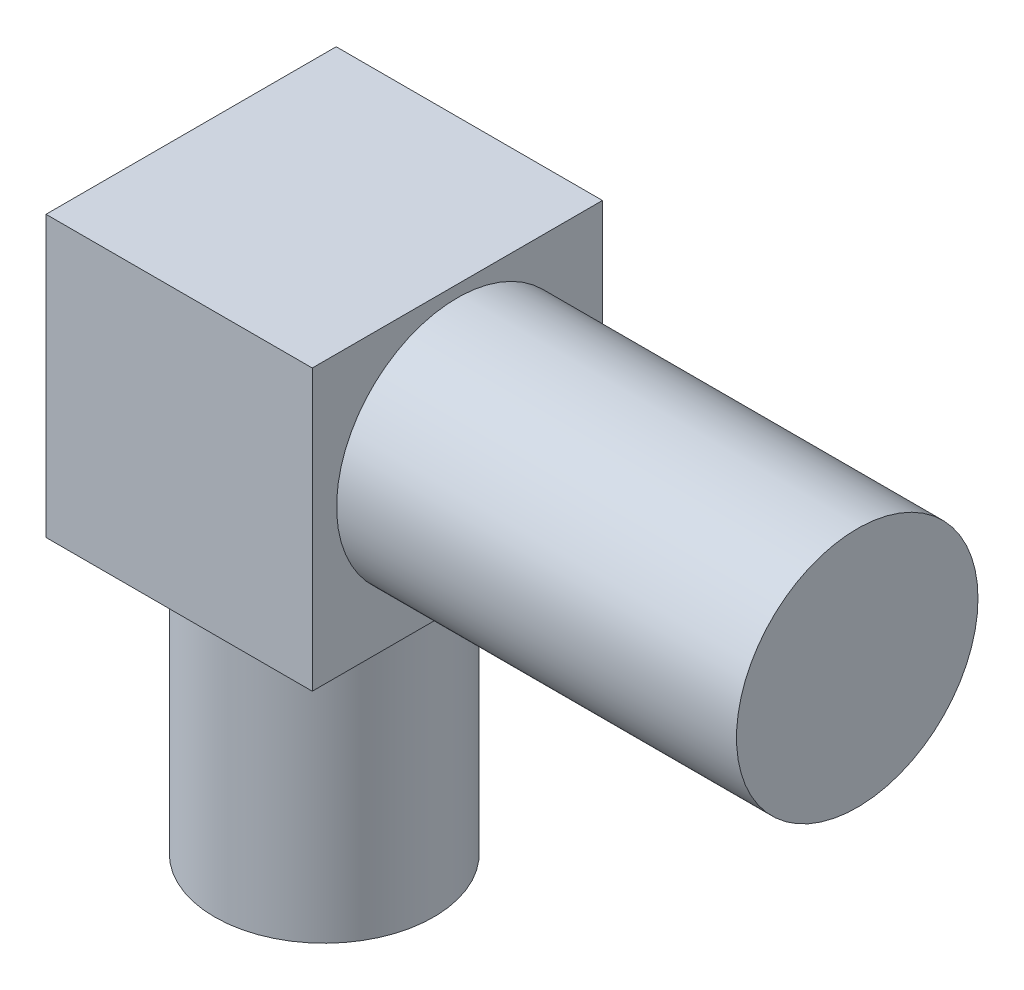
ISO-10303-21;
HEADER;
FILE_DESCRIPTION(('STEP AP214'),'2;1');
FILE_NAME('part.step','',(''),(''),'','','');
FILE_SCHEMA(('AUTOMOTIVE_DESIGN { 1 0 10303 214 1 1 1 1 }'));
ENDSEC;
DATA;
#1=APPLICATION_CONTEXT('core data for automotive mechanical design processes');
#2=APPLICATION_PROTOCOL_DEFINITION('international standard','automotive_design',2000,#1);
#3=PRODUCT_CONTEXT('',#1,'mechanical');
#4=PRODUCT('Part','Part','',(#3));
#5=PRODUCT_RELATED_PRODUCT_CATEGORY('part','',(#4));
#6=PRODUCT_DEFINITION_FORMATION('','',#4);
#7=PRODUCT_DEFINITION_CONTEXT('part definition',#1,'design');
#8=PRODUCT_DEFINITION('design','',#6,#7);
#9=PRODUCT_DEFINITION_SHAPE('','',#8);
#10=(LENGTH_UNIT() NAMED_UNIT(*) SI_UNIT(.MILLI.,.METRE.));
#11=(NAMED_UNIT(*) PLANE_ANGLE_UNIT() SI_UNIT($,.RADIAN.));
#12=(NAMED_UNIT(*) SI_UNIT($,.STERADIAN.) SOLID_ANGLE_UNIT());
#13=UNCERTAINTY_MEASURE_WITH_UNIT(LENGTH_MEASURE(1.E-05),#10,'distance_accuracy_value','');
#14=(GEOMETRIC_REPRESENTATION_CONTEXT(3) GLOBAL_UNCERTAINTY_ASSIGNED_CONTEXT((#13)) GLOBAL_UNIT_ASSIGNED_CONTEXT((#10,
#11,#12)) REPRESENTATION_CONTEXT('',''));
#15=CARTESIAN_POINT('',(0.,0.,0.));
#16=DIRECTION('',(0.,0.,1.));
#17=DIRECTION('',(1.,0.,0.));
#18=AXIS2_PLACEMENT_3D('',#15,#16,#17);
#19=CARTESIAN_POINT('',(0.,56.,0.));
#20=DIRECTION('',(0.,-1.,0.));
#21=DIRECTION('',(0.,0.,-1.));
#22=AXIS2_PLACEMENT_3D('',#19,#20,#21);
#23=CYLINDRICAL_SURFACE('',#22,21.9211314648751);
#24=CARTESIAN_POINT('',(0.,56.,0.));
#25=DIRECTION('',(0.,1.,0.));
#26=DIRECTION('',(0.,0.,1.));
#27=AXIS2_PLACEMENT_3D('',#24,#25,#26);
#28=CIRCLE('',#27,21.9211314648751);
#29=CARTESIAN_POINT('',(0.,56.,21.9211314648751));
#30=VERTEX_POINT('',#29);
#31=EDGE_CURVE('E49',#30,#30,#28,.T.);
#32=ORIENTED_EDGE('',*,*,#31,.F.);
#33=EDGE_LOOP('',(#32));
#34=FACE_BOUND('',#33,.T.);
#35=CARTESIAN_POINT('',(0.,0.,0.));
#36=DIRECTION('',(0.,1.,0.));
#37=DIRECTION('',(0.,0.,1.));
#38=AXIS2_PLACEMENT_3D('',#35,#36,#37);
#39=CIRCLE('',#38,21.9211314648751);
#40=CARTESIAN_POINT('',(0.,0.,21.9211314648751));
#41=VERTEX_POINT('',#40);
#42=EDGE_CURVE('E42',#41,#41,#39,.T.);
#43=ORIENTED_EDGE('',*,*,#42,.T.);
#44=EDGE_LOOP('',(#43));
#45=FACE_BOUND('',#44,.T.);
#46=ADVANCED_FACE('F39',(#34,#45),#23,.T.);
#47=CARTESIAN_POINT('',(0.,0.,0.));
#48=DIRECTION('',(0.,1.,0.));
#49=DIRECTION('',(0.,0.,1.));
#50=AXIS2_PLACEMENT_3D('',#47,#48,#49);
#51=PLANE('',#50);
#52=ORIENTED_EDGE('',*,*,#42,.F.);
#53=EDGE_LOOP('',(#52));
#54=FACE_BOUND('',#53,.T.);
#55=ADVANCED_FACE('F138',(#54),#51,.F.);
#56=CARTESIAN_POINT('',(26.6334731459423,112.,29.026841058146));
#57=DIRECTION('',(-1.,0.,0.));
#58=DIRECTION('',(0.,0.,1.));
#59=AXIS2_PLACEMENT_3D('',#56,#57,#58);
#60=PLANE('',#59);
#61=CARTESIAN_POINT('',(26.6334731459423,85.4953466597728,0.));
#62=DIRECTION('',(1.,0.,0.));
#63=DIRECTION('',(0.,0.,-1.));
#64=AXIS2_PLACEMENT_3D('',#61,#62,#63);
#65=CIRCLE('',#64,24.1568462081051);
#66=CARTESIAN_POINT('',(26.6334731459423,85.4953466597728,-24.1568462081051));
#67=VERTEX_POINT('',#66);
#68=EDGE_CURVE('E11',#67,#67,#65,.T.);
#69=ORIENTED_EDGE('',*,*,#68,.F.);
#70=EDGE_LOOP('',(#69));
#71=FACE_BOUND('',#70,.T.);
#72=DIRECTION('',(0.,0.,-1.));
#73=VECTOR('',#72,1.);
#74=CARTESIAN_POINT('',(26.6334731459423,56.,29.026841058146));
#75=LINE('',#74,#73);
#76=CARTESIAN_POINT('',(26.6334731459423,56.,29.026841058146));
#77=VERTEX_POINT('',#76);
#78=CARTESIAN_POINT('',(26.6334731459423,56.,-29.026841058146));
#79=VERTEX_POINT('',#78);
#80=EDGE_CURVE('E113',#77,#79,#75,.T.);
#81=ORIENTED_EDGE('',*,*,#80,.T.);
#82=DIRECTION('',(0.,-1.,0.));
#83=VECTOR('',#82,1.);
#84=CARTESIAN_POINT('',(26.6334731459423,112.,-29.026841058146));
#85=LINE('',#84,#83);
#86=CARTESIAN_POINT('',(26.6334731459423,112.,-29.026841058146));
#87=VERTEX_POINT('',#86);
#88=EDGE_CURVE('E102',#87,#79,#85,.T.);
#89=ORIENTED_EDGE('',*,*,#88,.F.);
#90=DIRECTION('',(0.,0.,-1.));
#91=VECTOR('',#90,1.);
#92=CARTESIAN_POINT('',(26.6334731459423,112.,29.026841058146));
#93=LINE('',#92,#91);
#94=CARTESIAN_POINT('',(26.6334731459423,112.,29.026841058146));
#95=VERTEX_POINT('',#94);
#96=EDGE_CURVE('E94',#95,#87,#93,.T.);
#97=ORIENTED_EDGE('',*,*,#96,.F.);
#98=DIRECTION('',(0.,-1.,0.));
#99=VECTOR('',#98,1.);
#100=CARTESIAN_POINT('',(26.6334731459423,112.,29.026841058146));
#101=LINE('',#100,#99);
#102=EDGE_CURVE('E109',#95,#77,#101,.T.);
#103=ORIENTED_EDGE('',*,*,#102,.T.);
#104=EDGE_LOOP('',(#81,#89,#97,#103));
#105=FACE_BOUND('',#104,.T.);
#106=ADVANCED_FACE('F140',(#71,#105),#60,.F.);
#107=CARTESIAN_POINT('',(-26.6334731459423,112.,-29.026841058146));
#108=DIRECTION('',(0.,0.,1.));
#109=DIRECTION('',(1.,0.,0.));
#110=AXIS2_PLACEMENT_3D('',#107,#108,#109);
#111=PLANE('',#110);
#112=DIRECTION('',(-1.,0.,0.));
#113=VECTOR('',#112,1.);
#114=CARTESIAN_POINT('',(-26.6334731459423,56.,-29.026841058146));
#115=LINE('',#114,#113);
#116=CARTESIAN_POINT('',(-26.6334731459423,56.,-29.026841058146));
#117=VERTEX_POINT('',#116);
#118=EDGE_CURVE('E100',#79,#117,#115,.T.);
#119=ORIENTED_EDGE('',*,*,#118,.T.);
#120=DIRECTION('',(0.,-1.,0.));
#121=VECTOR('',#120,1.);
#122=CARTESIAN_POINT('',(-26.6334731459423,112.,-29.026841058146));
#123=LINE('',#122,#121);
#124=CARTESIAN_POINT('',(-26.6334731459423,112.,-29.026841058146));
#125=VERTEX_POINT('',#124);
#126=EDGE_CURVE('E98',#125,#117,#123,.T.);
#127=ORIENTED_EDGE('',*,*,#126,.F.);
#128=DIRECTION('',(-1.,0.,0.));
#129=VECTOR('',#128,1.);
#130=CARTESIAN_POINT('',(-26.6334731459423,112.,-29.026841058146));
#131=LINE('',#130,#129);
#132=EDGE_CURVE('E89',#87,#125,#131,.T.);
#133=ORIENTED_EDGE('',*,*,#132,.F.);
#134=ORIENTED_EDGE('',*,*,#88,.T.);
#135=EDGE_LOOP('',(#119,#127,#133,#134));
#136=FACE_BOUND('',#135,.T.);
#137=ADVANCED_FACE('F99',(#136),#111,.F.);
#138=CARTESIAN_POINT('',(-26.6334731459423,112.,29.026841058146));
#139=DIRECTION('',(1.,0.,0.));
#140=DIRECTION('',(0.,0.,-1.));
#141=AXIS2_PLACEMENT_3D('',#138,#139,#140);
#142=PLANE('',#141);
#143=DIRECTION('',(0.,0.,1.));
#144=VECTOR('',#143,1.);
#145=CARTESIAN_POINT('',(-26.6334731459423,56.,29.026841058146));
#146=LINE('',#145,#144);
#147=CARTESIAN_POINT('',(-26.6334731459423,56.,29.026841058146));
#148=VERTEX_POINT('',#147);
#149=EDGE_CURVE('E75',#117,#148,#146,.T.);
#150=ORIENTED_EDGE('',*,*,#149,.T.);
#151=DIRECTION('',(0.,-1.,0.));
#152=VECTOR('',#151,1.);
#153=CARTESIAN_POINT('',(-26.6334731459423,112.,29.026841058146));
#154=LINE('',#153,#152);
#155=CARTESIAN_POINT('',(-26.6334731459423,112.,29.026841058146));
#156=VERTEX_POINT('',#155);
#157=EDGE_CURVE('E103',#156,#148,#154,.T.);
#158=ORIENTED_EDGE('',*,*,#157,.F.);
#159=DIRECTION('',(0.,0.,1.));
#160=VECTOR('',#159,1.);
#161=CARTESIAN_POINT('',(-26.6334731459423,112.,29.026841058146));
#162=LINE('',#161,#160);
#163=EDGE_CURVE('E92',#125,#156,#162,.T.);
#164=ORIENTED_EDGE('',*,*,#163,.F.);
#165=ORIENTED_EDGE('',*,*,#126,.T.);
#166=EDGE_LOOP('',(#150,#158,#164,#165));
#167=FACE_BOUND('',#166,.T.);
#168=ADVANCED_FACE('F105',(#167),#142,.F.);
#169=CARTESIAN_POINT('',(-26.6334731459423,112.,29.026841058146));
#170=DIRECTION('',(0.,0.,-1.));
#171=DIRECTION('',(-1.,0.,0.));
#172=AXIS2_PLACEMENT_3D('',#169,#170,#171);
#173=PLANE('',#172);
#174=DIRECTION('',(1.,0.,0.));
#175=VECTOR('',#174,1.);
#176=CARTESIAN_POINT('',(-26.6334731459423,56.,29.026841058146));
#177=LINE('',#176,#175);
#178=EDGE_CURVE('E81',#148,#77,#177,.T.);
#179=ORIENTED_EDGE('',*,*,#178,.T.);
#180=ORIENTED_EDGE('',*,*,#102,.F.);
#181=DIRECTION('',(1.,0.,0.));
#182=VECTOR('',#181,1.);
#183=CARTESIAN_POINT('',(-26.6334731459423,112.,29.026841058146));
#184=LINE('',#183,#182);
#185=EDGE_CURVE('E58',#156,#95,#184,.T.);
#186=ORIENTED_EDGE('',*,*,#185,.F.);
#187=ORIENTED_EDGE('',*,*,#157,.T.);
#188=EDGE_LOOP('',(#179,#180,#186,#187));
#189=FACE_BOUND('',#188,.T.);
#190=ADVANCED_FACE('F153',(#189),#173,.F.);
#191=CARTESIAN_POINT('',(0.,112.,0.));
#192=DIRECTION('',(0.,-1.,0.));
#193=DIRECTION('',(0.,0.,-1.));
#194=AXIS2_PLACEMENT_3D('',#191,#192,#193);
#195=PLANE('',#194);
#196=ORIENTED_EDGE('',*,*,#96,.T.);
#197=ORIENTED_EDGE('',*,*,#132,.T.);
#198=ORIENTED_EDGE('',*,*,#163,.T.);
#199=ORIENTED_EDGE('',*,*,#185,.T.);
#200=EDGE_LOOP('',(#196,#197,#198,#199));
#201=FACE_BOUND('',#200,.T.);
#202=ADVANCED_FACE('F90',(#201),#195,.F.);
#203=CARTESIAN_POINT('',(0.,56.,0.));
#204=DIRECTION('',(0.,-1.,0.));
#205=DIRECTION('',(0.,0.,-1.));
#206=AXIS2_PLACEMENT_3D('',#203,#204,#205);
#207=PLANE('',#206);
#208=ORIENTED_EDGE('',*,*,#31,.T.);
#209=EDGE_LOOP('',(#208));
#210=FACE_BOUND('',#209,.T.);
#211=ORIENTED_EDGE('',*,*,#80,.F.);
#212=ORIENTED_EDGE('',*,*,#178,.F.);
#213=ORIENTED_EDGE('',*,*,#149,.F.);
#214=ORIENTED_EDGE('',*,*,#118,.F.);
#215=EDGE_LOOP('',(#211,#212,#213,#214));
#216=FACE_BOUND('',#215,.T.);
#217=ADVANCED_FACE('F156',(#210,#216),#207,.T.);
#218=CARTESIAN_POINT('',(106.633473145942,85.4953466597728,0.));
#219=DIRECTION('',(-1.,0.,0.));
#220=DIRECTION('',(0.,0.,1.));
#221=AXIS2_PLACEMENT_3D('',#218,#219,#220);
#222=CYLINDRICAL_SURFACE('',#221,24.1568462081051);
#223=CARTESIAN_POINT('',(106.633473145942,85.4953466597728,0.));
#224=DIRECTION('',(1.,0.,0.));
#225=DIRECTION('',(0.,0.,-1.));
#226=AXIS2_PLACEMENT_3D('',#223,#224,#225);
#227=CIRCLE('',#226,24.1568462081051);
#228=CARTESIAN_POINT('',(106.633473145942,85.4953466597728,-24.1568462081051));
#229=VERTEX_POINT('',#228);
#230=EDGE_CURVE('E117',#229,#229,#227,.T.);
#231=ORIENTED_EDGE('',*,*,#230,.F.);
#232=EDGE_LOOP('',(#231));
#233=FACE_BOUND('',#232,.T.);
#234=ORIENTED_EDGE('',*,*,#68,.T.);
#235=EDGE_LOOP('',(#234));
#236=FACE_BOUND('',#235,.T.);
#237=ADVANCED_FACE('F159',(#233,#236),#222,.T.);
#238=CARTESIAN_POINT('',(106.633473145942,85.4953466597728,0.));
#239=DIRECTION('',(1.,0.,0.));
#240=DIRECTION('',(0.,0.,-1.));
#241=AXIS2_PLACEMENT_3D('',#238,#239,#240);
#242=PLANE('',#241);
#243=ORIENTED_EDGE('',*,*,#230,.T.);
#244=EDGE_LOOP('',(#243));
#245=FACE_BOUND('',#244,.T.);
#246=ADVANCED_FACE('F164',(#245),#242,.T.);
#247=CLOSED_SHELL('',(#46,#55,#106,#137,#168,#190,#202,#217,#237,#246));
#248=MANIFOLD_SOLID_BREP('B2',#247);
#249=ADVANCED_BREP_SHAPE_REPRESENTATION('',(#18,#248),#14);
#250=SHAPE_DEFINITION_REPRESENTATION(#9,#249);
ENDSEC;
END-ISO-10303-21;
